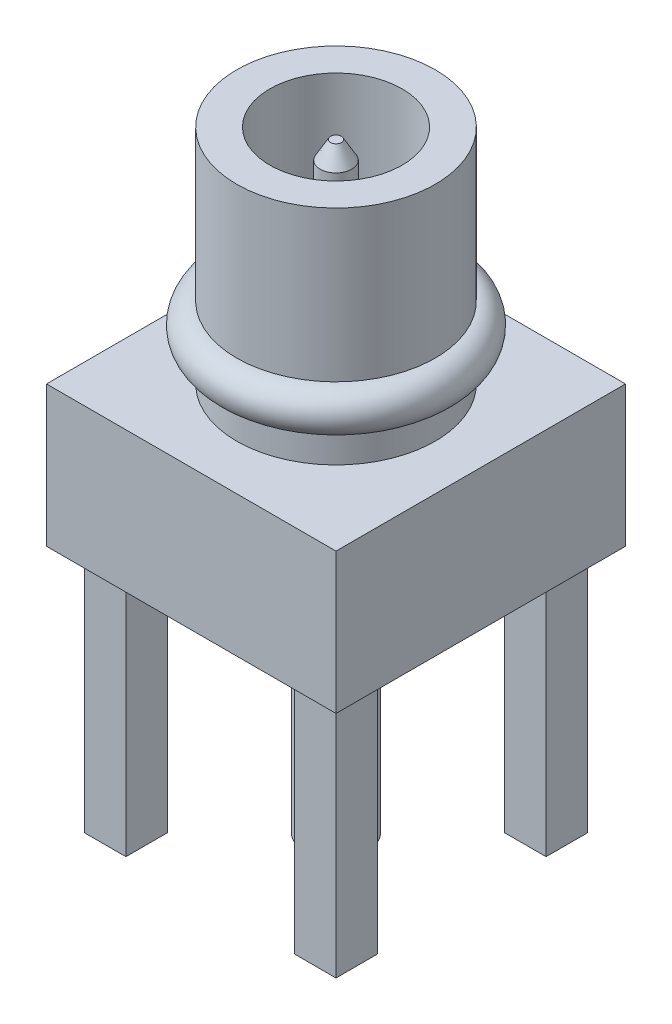
ISO-10303-21;
HEADER;
FILE_DESCRIPTION(('STEP AP214'),'2;1');
FILE_NAME('part.step','',(''),(''),'','','');
FILE_SCHEMA(('AUTOMOTIVE_DESIGN { 1 0 10303 214 1 1 1 1 }'));
ENDSEC;
DATA;
#1=APPLICATION_CONTEXT('core data for automotive mechanical design processes');
#2=APPLICATION_PROTOCOL_DEFINITION('international standard','automotive_design',2000,#1);
#3=PRODUCT_CONTEXT('',#1,'mechanical');
#4=PRODUCT('Part','Part','',(#3));
#5=PRODUCT_RELATED_PRODUCT_CATEGORY('part','',(#4));
#6=PRODUCT_DEFINITION_FORMATION('','',#4);
#7=PRODUCT_DEFINITION_CONTEXT('part definition',#1,'design');
#8=PRODUCT_DEFINITION('design','',#6,#7);
#9=PRODUCT_DEFINITION_SHAPE('','',#8);
#10=(LENGTH_UNIT() NAMED_UNIT(*) SI_UNIT(.MILLI.,.METRE.));
#11=(NAMED_UNIT(*) PLANE_ANGLE_UNIT() SI_UNIT($,.RADIAN.));
#12=(NAMED_UNIT(*) SI_UNIT($,.STERADIAN.) SOLID_ANGLE_UNIT());
#13=UNCERTAINTY_MEASURE_WITH_UNIT(LENGTH_MEASURE(1.E-05),#10,'distance_accuracy_value','');
#14=(GEOMETRIC_REPRESENTATION_CONTEXT(3) GLOBAL_UNCERTAINTY_ASSIGNED_CONTEXT((#13)) GLOBAL_UNIT_ASSIGNED_CONTEXT((#10,
#11,#12)) REPRESENTATION_CONTEXT('',''));
#15=CARTESIAN_POINT('',(0.,0.,0.));
#16=DIRECTION('',(0.,0.,1.));
#17=DIRECTION('',(1.,0.,0.));
#18=AXIS2_PLACEMENT_3D('',#15,#16,#17);
#19=CARTESIAN_POINT('',(0.,0.,0.));
#20=DIRECTION('',(0.,-1.,0.));
#21=DIRECTION('',(0.,0.,-1.));
#22=AXIS2_PLACEMENT_3D('',#19,#20,#21);
#23=PLANE('',#22);
#24=CARTESIAN_POINT('',(0.,0.,0.));
#25=DIRECTION('',(0.,-1.,0.));
#26=DIRECTION('',(0.,0.,-1.));
#27=AXIS2_PLACEMENT_3D('',#24,#25,#26);
#28=CIRCLE('',#27,1.);
#29=CARTESIAN_POINT('',(0.,0.,-1.));
#30=VERTEX_POINT('',#29);
#31=EDGE_CURVE('E694',#30,#30,#28,.T.);
#32=ORIENTED_EDGE('',*,*,#31,.F.);
#33=EDGE_LOOP('',(#32));
#34=FACE_BOUND('',#33,.T.);
#35=DIRECTION('',(0.,0.,-1.));
#36=VECTOR('',#35,1.);
#37=CARTESIAN_POINT('',(1.75,0.,1.75));
#38=LINE('',#37,#36);
#39=CARTESIAN_POINT('',(1.75,0.,1.75));
#40=VERTEX_POINT('',#39);
#41=CARTESIAN_POINT('',(1.75,0.,-1.75));
#42=VERTEX_POINT('',#41);
#43=EDGE_CURVE('E308',#40,#42,#38,.T.);
#44=ORIENTED_EDGE('',*,*,#43,.F.);
#45=DIRECTION('',(1.,0.,0.));
#46=VECTOR('',#45,1.);
#47=CARTESIAN_POINT('',(-1.75,0.,1.75));
#48=LINE('',#47,#46);
#49=CARTESIAN_POINT('',(-1.75,0.,1.75));
#50=VERTEX_POINT('',#49);
#51=EDGE_CURVE('E313',#50,#40,#48,.T.);
#52=ORIENTED_EDGE('',*,*,#51,.F.);
#53=DIRECTION('',(0.,0.,1.));
#54=VECTOR('',#53,1.);
#55=CARTESIAN_POINT('',(-1.75,0.,1.75));
#56=LINE('',#55,#54);
#57=CARTESIAN_POINT('',(-1.75,0.,-1.75));
#58=VERTEX_POINT('',#57);
#59=EDGE_CURVE('E324',#58,#50,#56,.T.);
#60=ORIENTED_EDGE('',*,*,#59,.F.);
#61=DIRECTION('',(-1.,0.,0.));
#62=VECTOR('',#61,1.);
#63=CARTESIAN_POINT('',(-1.75,0.,-1.75));
#64=LINE('',#63,#62);
#65=EDGE_CURVE('E322',#42,#58,#64,.T.);
#66=ORIENTED_EDGE('',*,*,#65,.F.);
#67=EDGE_LOOP('',(#44,#52,#60,#66));
#68=FACE_BOUND('',#67,.T.);
#69=DIRECTION('',(1.,0.,0.));
#70=VECTOR('',#69,1.);
#71=CARTESIAN_POINT('',(1.52,0.,-1.52));
#72=LINE('',#71,#70);
#73=CARTESIAN_POINT('',(1.02,0.,-1.52));
#74=VERTEX_POINT('',#73);
#75=CARTESIAN_POINT('',(1.52,0.,-1.52));
#76=VERTEX_POINT('',#75);
#77=EDGE_CURVE('E275',#74,#76,#72,.T.);
#78=ORIENTED_EDGE('',*,*,#77,.F.);
#79=DIRECTION('',(0.,0.,-1.));
#80=VECTOR('',#79,1.);
#81=CARTESIAN_POINT('',(1.02,0.,-1.52));
#82=LINE('',#81,#80);
#83=CARTESIAN_POINT('',(1.02,0.,-1.02));
#84=VERTEX_POINT('',#83);
#85=EDGE_CURVE('E261',#84,#74,#82,.T.);
#86=ORIENTED_EDGE('',*,*,#85,.F.);
#87=DIRECTION('',(-1.,0.,0.));
#88=VECTOR('',#87,1.);
#89=CARTESIAN_POINT('',(1.52,0.,-1.02));
#90=LINE('',#89,#88);
#91=CARTESIAN_POINT('',(1.52,0.,-1.02));
#92=VERTEX_POINT('',#91);
#93=EDGE_CURVE('E266',#92,#84,#90,.T.);
#94=ORIENTED_EDGE('',*,*,#93,.F.);
#95=DIRECTION('',(0.,0.,1.));
#96=VECTOR('',#95,1.);
#97=CARTESIAN_POINT('',(1.52,0.,-1.52));
#98=LINE('',#97,#96);
#99=EDGE_CURVE('E277',#76,#92,#98,.T.);
#100=ORIENTED_EDGE('',*,*,#99,.F.);
#101=EDGE_LOOP('',(#78,#86,#94,#100));
#102=FACE_BOUND('',#101,.T.);
#103=DIRECTION('',(1.,0.,0.));
#104=VECTOR('',#103,1.);
#105=CARTESIAN_POINT('',(-1.02,0.,-1.52000000000002));
#106=LINE('',#105,#104);
#107=CARTESIAN_POINT('',(-1.52,0.,-1.52000000000002));
#108=VERTEX_POINT('',#107);
#109=CARTESIAN_POINT('',(-1.02,0.,-1.52000000000002));
#110=VERTEX_POINT('',#109);
#111=EDGE_CURVE('E243',#108,#110,#106,.T.);
#112=ORIENTED_EDGE('',*,*,#111,.F.);
#113=DIRECTION('',(0.,0.,-1.));
#114=VECTOR('',#113,1.);
#115=CARTESIAN_POINT('',(-1.52,0.,-1.52000000000002));
#116=LINE('',#115,#114);
#117=CARTESIAN_POINT('',(-1.52,0.,-1.02000000000002));
#118=VERTEX_POINT('',#117);
#119=EDGE_CURVE('E229',#118,#108,#116,.T.);
#120=ORIENTED_EDGE('',*,*,#119,.F.);
#121=DIRECTION('',(-1.,0.,0.));
#122=VECTOR('',#121,1.);
#123=CARTESIAN_POINT('',(-1.02,0.,-1.02000000000002));
#124=LINE('',#123,#122);
#125=CARTESIAN_POINT('',(-1.02,0.,-1.02000000000002));
#126=VERTEX_POINT('',#125);
#127=EDGE_CURVE('E234',#126,#118,#124,.T.);
#128=ORIENTED_EDGE('',*,*,#127,.F.);
#129=DIRECTION('',(0.,0.,1.));
#130=VECTOR('',#129,1.);
#131=CARTESIAN_POINT('',(-1.02,0.,-1.52000000000002));
#132=LINE('',#131,#130);
#133=EDGE_CURVE('E245',#110,#126,#132,.T.);
#134=ORIENTED_EDGE('',*,*,#133,.F.);
#135=EDGE_LOOP('',(#112,#120,#128,#134));
#136=FACE_BOUND('',#135,.T.);
#137=DIRECTION('',(1.,0.,0.));
#138=VECTOR('',#137,1.);
#139=CARTESIAN_POINT('',(-1.02000000000001,0.,1.01999999999998));
#140=LINE('',#139,#138);
#141=CARTESIAN_POINT('',(-1.52000000000001,0.,1.01999999999998));
#142=VERTEX_POINT('',#141);
#143=CARTESIAN_POINT('',(-1.02000000000001,0.,1.01999999999998));
#144=VERTEX_POINT('',#143);
#145=EDGE_CURVE('E201',#142,#144,#140,.T.);
#146=ORIENTED_EDGE('',*,*,#145,.F.);
#147=DIRECTION('',(0.,0.,-1.));
#148=VECTOR('',#147,1.);
#149=CARTESIAN_POINT('',(-1.52000000000001,0.,1.01999999999998));
#150=LINE('',#149,#148);
#151=CARTESIAN_POINT('',(-1.52000000000001,0.,1.51999999999998));
#152=VERTEX_POINT('',#151);
#153=EDGE_CURVE('E198',#152,#142,#150,.T.);
#154=ORIENTED_EDGE('',*,*,#153,.F.);
#155=DIRECTION('',(-1.,0.,0.));
#156=VECTOR('',#155,1.);
#157=CARTESIAN_POINT('',(-1.02000000000001,0.,1.51999999999998));
#158=LINE('',#157,#156);
#159=CARTESIAN_POINT('',(-1.02000000000001,0.,1.51999999999998));
#160=VERTEX_POINT('',#159);
#161=EDGE_CURVE('E210',#160,#152,#158,.T.);
#162=ORIENTED_EDGE('',*,*,#161,.F.);
#163=DIRECTION('',(0.,0.,1.));
#164=VECTOR('',#163,1.);
#165=CARTESIAN_POINT('',(-1.02000000000001,0.,1.01999999999998));
#166=LINE('',#165,#164);
#167=EDGE_CURVE('E218',#144,#160,#166,.T.);
#168=ORIENTED_EDGE('',*,*,#167,.F.);
#169=EDGE_LOOP('',(#146,#154,#162,#168));
#170=FACE_BOUND('',#169,.T.);
#171=DIRECTION('',(1.,0.,0.));
#172=VECTOR('',#171,1.);
#173=CARTESIAN_POINT('',(1.51999999999999,0.,1.02));
#174=LINE('',#173,#172);
#175=CARTESIAN_POINT('',(1.01999999999999,0.,1.02));
#176=VERTEX_POINT('',#175);
#177=CARTESIAN_POINT('',(1.51999999999999,0.,1.02));
#178=VERTEX_POINT('',#177);
#179=EDGE_CURVE('E706',#176,#178,#174,.T.);
#180=ORIENTED_EDGE('',*,*,#179,.F.);
#181=DIRECTION('',(0.,0.,-1.));
#182=VECTOR('',#181,1.);
#183=CARTESIAN_POINT('',(1.01999999999999,0.,1.02));
#184=LINE('',#183,#182);
#185=CARTESIAN_POINT('',(1.01999999999999,0.,1.52));
#186=VERTEX_POINT('',#185);
#187=EDGE_CURVE('E196',#186,#176,#184,.T.);
#188=ORIENTED_EDGE('',*,*,#187,.F.);
#189=DIRECTION('',(-1.,0.,0.));
#190=VECTOR('',#189,1.);
#191=CARTESIAN_POINT('',(1.51999999999999,0.,1.52));
#192=LINE('',#191,#190);
#193=CARTESIAN_POINT('',(1.51999999999999,0.,1.52));
#194=VERTEX_POINT('',#193);
#195=EDGE_CURVE('E192',#194,#186,#192,.T.);
#196=ORIENTED_EDGE('',*,*,#195,.F.);
#197=DIRECTION('',(0.,0.,1.));
#198=VECTOR('',#197,1.);
#199=CARTESIAN_POINT('',(1.51999999999999,0.,1.02));
#200=LINE('',#199,#198);
#201=EDGE_CURVE('E708',#178,#194,#200,.T.);
#202=ORIENTED_EDGE('',*,*,#201,.F.);
#203=EDGE_LOOP('',(#180,#188,#196,#202));
#204=FACE_BOUND('',#203,.T.);
#205=ADVANCED_FACE('F35',(#34,#68,#102,#136,#170,#204),#23,.T.);
#206=CARTESIAN_POINT('',(0.,4.39,0.));
#207=DIRECTION('',(0.,-1.,0.));
#208=DIRECTION('',(0.,0.,-1.));
#209=AXIS2_PLACEMENT_3D('',#206,#207,#208);
#210=CYLINDRICAL_SURFACE('',#209,1.2);
#211=CARTESIAN_POINT('',(0.,4.39,0.));
#212=DIRECTION('',(0.,1.,0.));
#213=DIRECTION('',(0.,0.,1.));
#214=AXIS2_PLACEMENT_3D('',#211,#212,#213);
#215=CIRCLE('',#214,1.2);
#216=CARTESIAN_POINT('',(0.,4.39,1.2));
#217=VERTEX_POINT('',#216);
#218=EDGE_CURVE('E305',#217,#217,#215,.T.);
#219=ORIENTED_EDGE('',*,*,#218,.F.);
#220=EDGE_LOOP('',(#219));
#221=FACE_BOUND('',#220,.T.);
#222=CARTESIAN_POINT('',(0.,2.57,0.));
#223=DIRECTION('',(0.,-1.,0.));
#224=DIRECTION('',(0.,0.,-1.));
#225=AXIS2_PLACEMENT_3D('',#222,#223,#224);
#226=CIRCLE('',#225,1.2);
#227=CARTESIAN_POINT('',(0.,2.57,-1.2));
#228=VERTEX_POINT('',#227);
#229=EDGE_CURVE('E43',#228,#228,#226,.T.);
#230=ORIENTED_EDGE('',*,*,#229,.F.);
#231=EDGE_LOOP('',(#230));
#232=FACE_BOUND('',#231,.T.);
#233=ADVANCED_FACE('F345',(#221,#232),#210,.T.);
#234=CARTESIAN_POINT('',(0.,4.39,0.));
#235=DIRECTION('',(0.,1.,0.));
#236=DIRECTION('',(0.,0.,1.));
#237=AXIS2_PLACEMENT_3D('',#234,#235,#236);
#238=PLANE('',#237);
#239=CARTESIAN_POINT('',(0.,4.39,0.));
#240=DIRECTION('',(0.,-1.,0.));
#241=DIRECTION('',(0.,0.,-1.));
#242=AXIS2_PLACEMENT_3D('',#239,#240,#241);
#243=CIRCLE('',#242,0.8);
#244=CARTESIAN_POINT('',(0.,4.39,-0.8));
#245=VERTEX_POINT('',#244);
#246=EDGE_CURVE('E302',#245,#245,#243,.T.);
#247=ORIENTED_EDGE('',*,*,#246,.T.);
#248=EDGE_LOOP('',(#247));
#249=FACE_BOUND('',#248,.T.);
#250=ORIENTED_EDGE('',*,*,#218,.T.);
#251=EDGE_LOOP('',(#250));
#252=FACE_BOUND('',#251,.T.);
#253=ADVANCED_FACE('F347',(#249,#252),#238,.T.);
#254=CARTESIAN_POINT('',(0.,0.,0.));
#255=DIRECTION('',(0.,-1.,0.));
#256=DIRECTION('',(0.,0.,-1.));
#257=AXIS2_PLACEMENT_3D('',#254,#255,#256);
#258=CYLINDRICAL_SURFACE('',#257,0.8);
#259=ORIENTED_EDGE('',*,*,#246,.F.);
#260=EDGE_LOOP('',(#259));
#261=FACE_BOUND('',#260,.T.);
#262=CARTESIAN_POINT('',(0.,2.94,0.));
#263=DIRECTION('',(0.,-1.,0.));
#264=DIRECTION('',(0.,0.,-1.));
#265=AXIS2_PLACEMENT_3D('',#262,#263,#264);
#266=CIRCLE('',#265,0.8);
#267=CARTESIAN_POINT('',(0.,2.94,-0.8));
#268=VERTEX_POINT('',#267);
#269=EDGE_CURVE('E299',#268,#268,#266,.T.);
#270=ORIENTED_EDGE('',*,*,#269,.T.);
#271=EDGE_LOOP('',(#270));
#272=FACE_BOUND('',#271,.T.);
#273=ADVANCED_FACE('F355',(#261,#272),#258,.F.);
#274=CARTESIAN_POINT('',(0.,2.94,-0.8));
#275=DIRECTION('',(0.,-1.,0.));
#276=DIRECTION('',(0.,0.,-1.));
#277=AXIS2_PLACEMENT_3D('',#274,#275,#276);
#278=PLANE('',#277);
#279=ORIENTED_EDGE('',*,*,#269,.F.);
#280=EDGE_LOOP('',(#279));
#281=FACE_BOUND('',#280,.T.);
#282=CARTESIAN_POINT('',(0.,2.94,0.));
#283=DIRECTION('',(0.,-1.,0.));
#284=DIRECTION('',(0.,0.,-1.));
#285=AXIS2_PLACEMENT_3D('',#282,#283,#284);
#286=CIRCLE('',#285,0.1905);
#287=CARTESIAN_POINT('',(0.,2.94,-0.1905));
#288=VERTEX_POINT('',#287);
#289=EDGE_CURVE('E296',#288,#288,#286,.T.);
#290=ORIENTED_EDGE('',*,*,#289,.T.);
#291=EDGE_LOOP('',(#290));
#292=FACE_BOUND('',#291,.T.);
#293=ADVANCED_FACE('F400',(#281,#292),#278,.F.);
#294=CARTESIAN_POINT('',(0.,0.,0.));
#295=DIRECTION('',(0.,-1.,0.));
#296=DIRECTION('',(0.,0.,-1.));
#297=AXIS2_PLACEMENT_3D('',#294,#295,#296);
#298=CYLINDRICAL_SURFACE('',#297,0.1905);
#299=ORIENTED_EDGE('',*,*,#289,.F.);
#300=EDGE_LOOP('',(#299));
#301=FACE_BOUND('',#300,.T.);
#302=CARTESIAN_POINT('',(0.,4.04349364905389,0.));
#303=DIRECTION('',(0.,-1.,0.));
#304=DIRECTION('',(0.,0.,-1.));
#305=AXIS2_PLACEMENT_3D('',#302,#303,#304);
#306=CIRCLE('',#305,0.1905);
#307=CARTESIAN_POINT('',(0.,4.04349364905389,-0.1905));
#308=VERTEX_POINT('',#307);
#309=EDGE_CURVE('E293',#308,#308,#306,.T.);
#310=ORIENTED_EDGE('',*,*,#309,.T.);
#311=EDGE_LOOP('',(#310));
#312=FACE_BOUND('',#311,.T.);
#313=ADVANCED_FACE('F396',(#301,#312),#298,.T.);
#314=CARTESIAN_POINT('',(0.,4.26,0.));
#315=DIRECTION('',(0.,-1.,0.));
#316=DIRECTION('',(0.,0.,-1.));
#317=AXIS2_PLACEMENT_3D('',#314,#315,#316);
#318=CONICAL_SURFACE('',#317,0.0655000000000007,0.5235987755983);
#319=ORIENTED_EDGE('',*,*,#309,.F.);
#320=EDGE_LOOP('',(#319));
#321=FACE_BOUND('',#320,.T.);
#322=CARTESIAN_POINT('',(0.,4.26,0.));
#323=DIRECTION('',(0.,-1.,0.));
#324=DIRECTION('',(0.,0.,-1.));
#325=AXIS2_PLACEMENT_3D('',#322,#323,#324);
#326=CIRCLE('',#325,0.0655000000000007);
#327=CARTESIAN_POINT('',(0.,4.26,-0.0655000000000007));
#328=VERTEX_POINT('',#327);
#329=EDGE_CURVE('E290',#328,#328,#326,.T.);
#330=ORIENTED_EDGE('',*,*,#329,.T.);
#331=EDGE_LOOP('',(#330));
#332=FACE_BOUND('',#331,.T.);
#333=ADVANCED_FACE('F389',(#321,#332),#318,.T.);
#334=CARTESIAN_POINT('',(0.,4.26,-0.0655000000000007));
#335=DIRECTION('',(0.,-1.,0.));
#336=DIRECTION('',(0.,0.,-1.));
#337=AXIS2_PLACEMENT_3D('',#334,#335,#336);
#338=PLANE('',#337);
#339=ORIENTED_EDGE('',*,*,#329,.F.);
#340=EDGE_LOOP('',(#339));
#341=FACE_BOUND('',#340,.T.);
#342=ADVANCED_FACE('F380',(#341),#338,.F.);
#343=CARTESIAN_POINT('',(0.,2.32,0.));
#344=DIRECTION('',(0.,-1.,0.));
#345=DIRECTION('',(0.,0.,-1.));
#346=AXIS2_PLACEMENT_3D('',#343,#344,#345);
#347=TOROIDAL_SURFACE('',#346,1.2,0.25);
#348=CARTESIAN_POINT('',(0.,2.07,0.));
#349=DIRECTION('',(0.,1.,0.));
#350=DIRECTION('',(0.,0.,1.));
#351=AXIS2_PLACEMENT_3D('',#348,#349,#350);
#352=CIRCLE('',#351,1.2);
#353=CARTESIAN_POINT('',(0.,2.07,1.2));
#354=VERTEX_POINT('',#353);
#355=EDGE_CURVE('E11',#354,#354,#352,.T.);
#356=ORIENTED_EDGE('',*,*,#355,.T.);
#357=EDGE_LOOP('',(#356));
#358=FACE_BOUND('',#357,.T.);
#359=ORIENTED_EDGE('',*,*,#229,.T.);
#360=EDGE_LOOP('',(#359));
#361=FACE_BOUND('',#360,.T.);
#362=ADVANCED_FACE('F343',(#358,#361),#347,.T.);
#363=CARTESIAN_POINT('',(-1.75,1.7,1.75));
#364=DIRECTION('',(0.,0.,-1.));
#365=DIRECTION('',(-1.,0.,0.));
#366=AXIS2_PLACEMENT_3D('',#363,#364,#365);
#367=PLANE('',#366);
#368=ORIENTED_EDGE('',*,*,#51,.T.);
#369=DIRECTION('',(0.,-1.,0.));
#370=VECTOR('',#369,1.);
#371=CARTESIAN_POINT('',(1.75,1.7,1.75));
#372=LINE('',#371,#370);
#373=CARTESIAN_POINT('',(1.75,1.7,1.75));
#374=VERTEX_POINT('',#373);
#375=EDGE_CURVE('E319',#374,#40,#372,.T.);
#376=ORIENTED_EDGE('',*,*,#375,.F.);
#377=DIRECTION('',(1.,0.,0.));
#378=VECTOR('',#377,1.);
#379=CARTESIAN_POINT('',(-1.75,1.7,1.75));
#380=LINE('',#379,#378);
#381=CARTESIAN_POINT('',(-1.75,1.7,1.75));
#382=VERTEX_POINT('',#381);
#383=EDGE_CURVE('E317',#382,#374,#380,.T.);
#384=ORIENTED_EDGE('',*,*,#383,.F.);
#385=DIRECTION('',(0.,-1.,0.));
#386=VECTOR('',#385,1.);
#387=CARTESIAN_POINT('',(-1.75,1.7,1.75));
#388=LINE('',#387,#386);
#389=EDGE_CURVE('E329',#382,#50,#388,.T.);
#390=ORIENTED_EDGE('',*,*,#389,.T.);
#391=EDGE_LOOP('',(#368,#376,#384,#390));
#392=FACE_BOUND('',#391,.T.);
#393=ADVANCED_FACE('F379',(#392),#367,.F.);
#394=CARTESIAN_POINT('',(-1.75,1.7,1.75));
#395=DIRECTION('',(1.,0.,0.));
#396=DIRECTION('',(0.,0.,-1.));
#397=AXIS2_PLACEMENT_3D('',#394,#395,#396);
#398=PLANE('',#397);
#399=ORIENTED_EDGE('',*,*,#59,.T.);
#400=ORIENTED_EDGE('',*,*,#389,.F.);
#401=DIRECTION('',(0.,0.,1.));
#402=VECTOR('',#401,1.);
#403=CARTESIAN_POINT('',(-1.75,1.7,1.75));
#404=LINE('',#403,#402);
#405=CARTESIAN_POINT('',(-1.75,1.7,-1.75));
#406=VERTEX_POINT('',#405);
#407=EDGE_CURVE('E315',#406,#382,#404,.T.);
#408=ORIENTED_EDGE('',*,*,#407,.F.);
#409=DIRECTION('',(0.,-1.,0.));
#410=VECTOR('',#409,1.);
#411=CARTESIAN_POINT('',(-1.75,1.7,-1.75));
#412=LINE('',#411,#410);
#413=EDGE_CURVE('E332',#406,#58,#412,.T.);
#414=ORIENTED_EDGE('',*,*,#413,.T.);
#415=EDGE_LOOP('',(#399,#400,#408,#414));
#416=FACE_BOUND('',#415,.T.);
#417=ADVANCED_FACE('F386',(#416),#398,.F.);
#418=CARTESIAN_POINT('',(-1.75,1.7,-1.75));
#419=DIRECTION('',(0.,0.,1.));
#420=DIRECTION('',(1.,0.,0.));
#421=AXIS2_PLACEMENT_3D('',#418,#419,#420);
#422=PLANE('',#421);
#423=ORIENTED_EDGE('',*,*,#65,.T.);
#424=ORIENTED_EDGE('',*,*,#413,.F.);
#425=DIRECTION('',(-1.,0.,0.));
#426=VECTOR('',#425,1.);
#427=CARTESIAN_POINT('',(-1.75,1.7,-1.75));
#428=LINE('',#427,#426);
#429=CARTESIAN_POINT('',(1.75,1.7,-1.75));
#430=VERTEX_POINT('',#429);
#431=EDGE_CURVE('E312',#430,#406,#428,.T.);
#432=ORIENTED_EDGE('',*,*,#431,.F.);
#433=DIRECTION('',(0.,-1.,0.));
#434=VECTOR('',#433,1.);
#435=CARTESIAN_POINT('',(1.75,1.7,-1.75));
#436=LINE('',#435,#434);
#437=EDGE_CURVE('E335',#430,#42,#436,.T.);
#438=ORIENTED_EDGE('',*,*,#437,.T.);
#439=EDGE_LOOP('',(#423,#424,#432,#438));
#440=FACE_BOUND('',#439,.T.);
#441=ADVANCED_FACE('F766',(#440),#422,.F.);
#442=CARTESIAN_POINT('',(1.75,1.7,1.75));
#443=DIRECTION('',(-1.,0.,0.));
#444=DIRECTION('',(0.,0.,1.));
#445=AXIS2_PLACEMENT_3D('',#442,#443,#444);
#446=PLANE('',#445);
#447=ORIENTED_EDGE('',*,*,#43,.T.);
#448=ORIENTED_EDGE('',*,*,#437,.F.);
#449=DIRECTION('',(0.,0.,-1.));
#450=VECTOR('',#449,1.);
#451=CARTESIAN_POINT('',(1.75,1.7,1.75));
#452=LINE('',#451,#450);
#453=EDGE_CURVE('E309',#374,#430,#452,.T.);
#454=ORIENTED_EDGE('',*,*,#453,.F.);
#455=ORIENTED_EDGE('',*,*,#375,.T.);
#456=EDGE_LOOP('',(#447,#448,#454,#455));
#457=FACE_BOUND('',#456,.T.);
#458=ADVANCED_FACE('F37',(#457),#446,.F.);
#459=CARTESIAN_POINT('',(0.,1.7,0.));
#460=DIRECTION('',(0.,-1.,0.));
#461=DIRECTION('',(0.,0.,-1.));
#462=AXIS2_PLACEMENT_3D('',#459,#460,#461);
#463=PLANE('',#462);
#464=CARTESIAN_POINT('',(0.,1.7,0.));
#465=DIRECTION('',(0.,-1.,0.));
#466=DIRECTION('',(0.,0.,-1.));
#467=AXIS2_PLACEMENT_3D('',#464,#465,#466);
#468=CIRCLE('',#467,1.2);
#469=CARTESIAN_POINT('',(0.,1.7,-1.2));
#470=VERTEX_POINT('',#469);
#471=EDGE_CURVE('E338',#470,#470,#468,.F.);
#472=ORIENTED_EDGE('',*,*,#471,.F.);
#473=EDGE_LOOP('',(#472));
#474=FACE_BOUND('',#473,.T.);
#475=ORIENTED_EDGE('',*,*,#453,.T.);
#476=ORIENTED_EDGE('',*,*,#431,.T.);
#477=ORIENTED_EDGE('',*,*,#407,.T.);
#478=ORIENTED_EDGE('',*,*,#383,.T.);
#479=EDGE_LOOP('',(#475,#476,#477,#478));
#480=FACE_BOUND('',#479,.T.);
#481=ADVANCED_FACE('F364',(#474,#480),#463,.F.);
#482=ORIENTED_EDGE('',*,*,#471,.T.);
#483=EDGE_LOOP('',(#482));
#484=FACE_BOUND('',#483,.T.);
#485=ORIENTED_EDGE('',*,*,#355,.F.);
#486=EDGE_LOOP('',(#485));
#487=FACE_BOUND('',#486,.T.);
#488=ADVANCED_FACE('F350',(#484,#487),#210,.T.);
#489=CARTESIAN_POINT('',(1.02,-3.,-1.52));
#490=DIRECTION('',(1.,0.,0.));
#491=DIRECTION('',(0.,0.,-1.));
#492=AXIS2_PLACEMENT_3D('',#489,#490,#491);
#493=PLANE('',#492);
#494=ORIENTED_EDGE('',*,*,#85,.T.);
#495=DIRECTION('',(0.,1.,0.));
#496=VECTOR('',#495,1.);
#497=CARTESIAN_POINT('',(1.02,-3.,-1.52));
#498=LINE('',#497,#496);
#499=CARTESIAN_POINT('',(1.02,-3.,-1.52));
#500=VERTEX_POINT('',#499);
#501=EDGE_CURVE('E288',#500,#74,#498,.T.);
#502=ORIENTED_EDGE('',*,*,#501,.F.);
#503=DIRECTION('',(0.,0.,-1.));
#504=VECTOR('',#503,1.);
#505=CARTESIAN_POINT('',(1.02,-3.,-1.52));
#506=LINE('',#505,#504);
#507=CARTESIAN_POINT('',(1.02,-3.,-1.02));
#508=VERTEX_POINT('',#507);
#509=EDGE_CURVE('E262',#508,#500,#506,.T.);
#510=ORIENTED_EDGE('',*,*,#509,.F.);
#511=DIRECTION('',(0.,1.,0.));
#512=VECTOR('',#511,1.);
#513=CARTESIAN_POINT('',(1.02,-3.,-1.02));
#514=LINE('',#513,#512);
#515=EDGE_CURVE('E272',#508,#84,#514,.T.);
#516=ORIENTED_EDGE('',*,*,#515,.T.);
#517=EDGE_LOOP('',(#494,#502,#510,#516));
#518=FACE_BOUND('',#517,.T.);
#519=ADVANCED_FACE('F363',(#518),#493,.F.);
#520=CARTESIAN_POINT('',(1.52,-3.,-1.52));
#521=DIRECTION('',(0.,0.,1.));
#522=DIRECTION('',(1.,0.,0.));
#523=AXIS2_PLACEMENT_3D('',#520,#521,#522);
#524=PLANE('',#523);
#525=ORIENTED_EDGE('',*,*,#77,.T.);
#526=DIRECTION('',(0.,1.,0.));
#527=VECTOR('',#526,1.);
#528=CARTESIAN_POINT('',(1.52,-3.,-1.52));
#529=LINE('',#528,#527);
#530=CARTESIAN_POINT('',(1.52,-3.,-1.52));
#531=VERTEX_POINT('',#530);
#532=EDGE_CURVE('E285',#531,#76,#529,.T.);
#533=ORIENTED_EDGE('',*,*,#532,.F.);
#534=DIRECTION('',(1.,0.,0.));
#535=VECTOR('',#534,1.);
#536=CARTESIAN_POINT('',(1.52,-3.,-1.52));
#537=LINE('',#536,#535);
#538=EDGE_CURVE('E265',#500,#531,#537,.T.);
#539=ORIENTED_EDGE('',*,*,#538,.F.);
#540=ORIENTED_EDGE('',*,*,#501,.T.);
#541=EDGE_LOOP('',(#525,#533,#539,#540));
#542=FACE_BOUND('',#541,.T.);
#543=ADVANCED_FACE('F370',(#542),#524,.F.);
#544=CARTESIAN_POINT('',(1.52,-3.,-1.52));
#545=DIRECTION('',(-1.,0.,0.));
#546=DIRECTION('',(0.,0.,1.));
#547=AXIS2_PLACEMENT_3D('',#544,#545,#546);
#548=PLANE('',#547);
#549=ORIENTED_EDGE('',*,*,#99,.T.);
#550=DIRECTION('',(0.,1.,0.));
#551=VECTOR('',#550,1.);
#552=CARTESIAN_POINT('',(1.52,-3.,-1.02));
#553=LINE('',#552,#551);
#554=CARTESIAN_POINT('',(1.52,-3.,-1.02));
#555=VERTEX_POINT('',#554);
#556=EDGE_CURVE('E283',#555,#92,#553,.T.);
#557=ORIENTED_EDGE('',*,*,#556,.F.);
#558=DIRECTION('',(0.,0.,1.));
#559=VECTOR('',#558,1.);
#560=CARTESIAN_POINT('',(1.52,-3.,-1.52));
#561=LINE('',#560,#559);
#562=EDGE_CURVE('E268',#531,#555,#561,.T.);
#563=ORIENTED_EDGE('',*,*,#562,.F.);
#564=ORIENTED_EDGE('',*,*,#532,.T.);
#565=EDGE_LOOP('',(#549,#557,#563,#564));
#566=FACE_BOUND('',#565,.T.);
#567=ADVANCED_FACE('F466',(#566),#548,.F.);
#568=CARTESIAN_POINT('',(1.52,-3.,-1.02));
#569=DIRECTION('',(0.,0.,-1.));
#570=DIRECTION('',(-1.,0.,0.));
#571=AXIS2_PLACEMENT_3D('',#568,#569,#570);
#572=PLANE('',#571);
#573=ORIENTED_EDGE('',*,*,#93,.T.);
#574=ORIENTED_EDGE('',*,*,#515,.F.);
#575=DIRECTION('',(-1.,0.,0.));
#576=VECTOR('',#575,1.);
#577=CARTESIAN_POINT('',(1.52,-3.,-1.02));
#578=LINE('',#577,#576);
#579=EDGE_CURVE('E270',#555,#508,#578,.T.);
#580=ORIENTED_EDGE('',*,*,#579,.F.);
#581=ORIENTED_EDGE('',*,*,#556,.T.);
#582=EDGE_LOOP('',(#573,#574,#580,#581));
#583=FACE_BOUND('',#582,.T.);
#584=ADVANCED_FACE('F475',(#583),#572,.F.);
#585=CARTESIAN_POINT('',(0.,-3.,0.));
#586=DIRECTION('',(0.,-1.,0.));
#587=DIRECTION('',(0.,0.,-1.));
#588=AXIS2_PLACEMENT_3D('',#585,#586,#587);
#589=PLANE('',#588);
#590=ORIENTED_EDGE('',*,*,#509,.T.);
#591=ORIENTED_EDGE('',*,*,#538,.T.);
#592=ORIENTED_EDGE('',*,*,#562,.T.);
#593=ORIENTED_EDGE('',*,*,#579,.T.);
#594=EDGE_LOOP('',(#590,#591,#592,#593));
#595=FACE_BOUND('',#594,.T.);
#596=ADVANCED_FACE('F485',(#595),#589,.T.);
#597=CARTESIAN_POINT('',(-1.52,-3.,-1.52000000000002));
#598=DIRECTION('',(1.,0.,0.));
#599=DIRECTION('',(0.,0.,-1.));
#600=AXIS2_PLACEMENT_3D('',#597,#598,#599);
#601=PLANE('',#600);
#602=ORIENTED_EDGE('',*,*,#119,.T.);
#603=DIRECTION('',(0.,1.,0.));
#604=VECTOR('',#603,1.);
#605=CARTESIAN_POINT('',(-1.52,-3.,-1.52000000000002));
#606=LINE('',#605,#604);
#607=CARTESIAN_POINT('',(-1.52,-3.,-1.52000000000002));
#608=VERTEX_POINT('',#607);
#609=EDGE_CURVE('E256',#608,#108,#606,.T.);
#610=ORIENTED_EDGE('',*,*,#609,.F.);
#611=DIRECTION('',(0.,0.,-1.));
#612=VECTOR('',#611,1.);
#613=CARTESIAN_POINT('',(-1.52,-3.,-1.52000000000002));
#614=LINE('',#613,#612);
#615=CARTESIAN_POINT('',(-1.52,-3.,-1.02000000000002));
#616=VERTEX_POINT('',#615);
#617=EDGE_CURVE('E230',#616,#608,#614,.T.);
#618=ORIENTED_EDGE('',*,*,#617,.F.);
#619=DIRECTION('',(0.,1.,0.));
#620=VECTOR('',#619,1.);
#621=CARTESIAN_POINT('',(-1.52,-3.,-1.02000000000002));
#622=LINE('',#621,#620);
#623=EDGE_CURVE('E240',#616,#118,#622,.T.);
#624=ORIENTED_EDGE('',*,*,#623,.T.);
#625=EDGE_LOOP('',(#602,#610,#618,#624));
#626=FACE_BOUND('',#625,.T.);
#627=ADVANCED_FACE('F495',(#626),#601,.F.);
#628=CARTESIAN_POINT('',(-1.02,-3.,-1.52000000000002));
#629=DIRECTION('',(0.,0.,1.));
#630=DIRECTION('',(1.,0.,0.));
#631=AXIS2_PLACEMENT_3D('',#628,#629,#630);
#632=PLANE('',#631);
#633=ORIENTED_EDGE('',*,*,#111,.T.);
#634=DIRECTION('',(0.,1.,0.));
#635=VECTOR('',#634,1.);
#636=CARTESIAN_POINT('',(-1.02,-3.,-1.52000000000002));
#637=LINE('',#636,#635);
#638=CARTESIAN_POINT('',(-1.02,-3.,-1.52000000000002));
#639=VERTEX_POINT('',#638);
#640=EDGE_CURVE('E253',#639,#110,#637,.T.);
#641=ORIENTED_EDGE('',*,*,#640,.F.);
#642=DIRECTION('',(1.,0.,0.));
#643=VECTOR('',#642,1.);
#644=CARTESIAN_POINT('',(-1.02,-3.,-1.52000000000002));
#645=LINE('',#644,#643);
#646=EDGE_CURVE('E233',#608,#639,#645,.T.);
#647=ORIENTED_EDGE('',*,*,#646,.F.);
#648=ORIENTED_EDGE('',*,*,#609,.T.);
#649=EDGE_LOOP('',(#633,#641,#647,#648));
#650=FACE_BOUND('',#649,.T.);
#651=ADVANCED_FACE('F520',(#650),#632,.F.);
#652=CARTESIAN_POINT('',(-1.02,-3.,-1.52000000000002));
#653=DIRECTION('',(-1.,0.,0.));
#654=DIRECTION('',(0.,0.,1.));
#655=AXIS2_PLACEMENT_3D('',#652,#653,#654);
#656=PLANE('',#655);
#657=ORIENTED_EDGE('',*,*,#133,.T.);
#658=DIRECTION('',(0.,1.,0.));
#659=VECTOR('',#658,1.);
#660=CARTESIAN_POINT('',(-1.02,-3.,-1.02000000000002));
#661=LINE('',#660,#659);
#662=CARTESIAN_POINT('',(-1.02,-3.,-1.02000000000002));
#663=VERTEX_POINT('',#662);
#664=EDGE_CURVE('E251',#663,#126,#661,.T.);
#665=ORIENTED_EDGE('',*,*,#664,.F.);
#666=DIRECTION('',(0.,0.,1.));
#667=VECTOR('',#666,1.);
#668=CARTESIAN_POINT('',(-1.02,-3.,-1.52000000000002));
#669=LINE('',#668,#667);
#670=EDGE_CURVE('E236',#639,#663,#669,.T.);
#671=ORIENTED_EDGE('',*,*,#670,.F.);
#672=ORIENTED_EDGE('',*,*,#640,.T.);
#673=EDGE_LOOP('',(#657,#665,#671,#672));
#674=FACE_BOUND('',#673,.T.);
#675=ADVANCED_FACE('F530',(#674),#656,.F.);
#676=CARTESIAN_POINT('',(-1.02,-3.,-1.02000000000002));
#677=DIRECTION('',(0.,0.,-1.));
#678=DIRECTION('',(-1.,0.,0.));
#679=AXIS2_PLACEMENT_3D('',#676,#677,#678);
#680=PLANE('',#679);
#681=ORIENTED_EDGE('',*,*,#127,.T.);
#682=ORIENTED_EDGE('',*,*,#623,.F.);
#683=DIRECTION('',(-1.,0.,0.));
#684=VECTOR('',#683,1.);
#685=CARTESIAN_POINT('',(-1.02,-3.,-1.02000000000002));
#686=LINE('',#685,#684);
#687=EDGE_CURVE('E238',#663,#616,#686,.T.);
#688=ORIENTED_EDGE('',*,*,#687,.F.);
#689=ORIENTED_EDGE('',*,*,#664,.T.);
#690=EDGE_LOOP('',(#681,#682,#688,#689));
#691=FACE_BOUND('',#690,.T.);
#692=ADVANCED_FACE('F540',(#691),#680,.F.);
#693=CARTESIAN_POINT('',(0.,-3.,0.));
#694=DIRECTION('',(0.,-1.,0.));
#695=DIRECTION('',(0.,0.,-1.));
#696=AXIS2_PLACEMENT_3D('',#693,#694,#695);
#697=PLANE('',#696);
#698=ORIENTED_EDGE('',*,*,#617,.T.);
#699=ORIENTED_EDGE('',*,*,#646,.T.);
#700=ORIENTED_EDGE('',*,*,#670,.T.);
#701=ORIENTED_EDGE('',*,*,#687,.T.);
#702=EDGE_LOOP('',(#698,#699,#700,#701));
#703=FACE_BOUND('',#702,.T.);
#704=ADVANCED_FACE('F550',(#703),#697,.T.);
#705=CARTESIAN_POINT('',(-1.52000000000001,-3.,1.01999999999998));
#706=DIRECTION('',(1.,0.,0.));
#707=DIRECTION('',(0.,0.,-1.));
#708=AXIS2_PLACEMENT_3D('',#705,#706,#707);
#709=PLANE('',#708);
#710=ORIENTED_EDGE('',*,*,#153,.T.);
#711=DIRECTION('',(0.,1.,0.));
#712=VECTOR('',#711,1.);
#713=CARTESIAN_POINT('',(-1.52000000000001,-3.,1.01999999999998));
#714=LINE('',#713,#712);
#715=CARTESIAN_POINT('',(-1.52000000000001,-3.,1.01999999999998));
#716=VERTEX_POINT('',#715);
#717=EDGE_CURVE('E227',#716,#142,#714,.T.);
#718=ORIENTED_EDGE('',*,*,#717,.F.);
#719=DIRECTION('',(0.,0.,-1.));
#720=VECTOR('',#719,1.);
#721=CARTESIAN_POINT('',(-1.52000000000001,-3.,1.01999999999998));
#722=LINE('',#721,#720);
#723=CARTESIAN_POINT('',(-1.52000000000001,-3.,1.51999999999998));
#724=VERTEX_POINT('',#723);
#725=EDGE_CURVE('E206',#724,#716,#722,.T.);
#726=ORIENTED_EDGE('',*,*,#725,.F.);
#727=DIRECTION('',(0.,1.,0.));
#728=VECTOR('',#727,1.);
#729=CARTESIAN_POINT('',(-1.52000000000001,-3.,1.51999999999998));
#730=LINE('',#729,#728);
#731=EDGE_CURVE('E215',#724,#152,#730,.T.);
#732=ORIENTED_EDGE('',*,*,#731,.T.);
#733=EDGE_LOOP('',(#710,#718,#726,#732));
#734=FACE_BOUND('',#733,.T.);
#735=ADVANCED_FACE('F560',(#734),#709,.F.);
#736=CARTESIAN_POINT('',(-1.02000000000001,-3.,1.01999999999998));
#737=DIRECTION('',(0.,0.,1.));
#738=DIRECTION('',(1.,0.,0.));
#739=AXIS2_PLACEMENT_3D('',#736,#737,#738);
#740=PLANE('',#739);
#741=ORIENTED_EDGE('',*,*,#145,.T.);
#742=DIRECTION('',(0.,1.,0.));
#743=VECTOR('',#742,1.);
#744=CARTESIAN_POINT('',(-1.02000000000001,-3.,1.01999999999998));
#745=LINE('',#744,#743);
#746=CARTESIAN_POINT('',(-1.02000000000001,-3.,1.01999999999998));
#747=VERTEX_POINT('',#746);
#748=EDGE_CURVE('E224',#747,#144,#745,.T.);
#749=ORIENTED_EDGE('',*,*,#748,.F.);
#750=DIRECTION('',(1.,0.,0.));
#751=VECTOR('',#750,1.);
#752=CARTESIAN_POINT('',(-1.02000000000001,-3.,1.01999999999998));
#753=LINE('',#752,#751);
#754=EDGE_CURVE('E209',#716,#747,#753,.T.);
#755=ORIENTED_EDGE('',*,*,#754,.F.);
#756=ORIENTED_EDGE('',*,*,#717,.T.);
#757=EDGE_LOOP('',(#741,#749,#755,#756));
#758=FACE_BOUND('',#757,.T.);
#759=ADVANCED_FACE('F570',(#758),#740,.F.);
#760=CARTESIAN_POINT('',(-1.02000000000001,-3.,1.01999999999998));
#761=DIRECTION('',(-1.,0.,0.));
#762=DIRECTION('',(0.,0.,1.));
#763=AXIS2_PLACEMENT_3D('',#760,#761,#762);
#764=PLANE('',#763);
#765=ORIENTED_EDGE('',*,*,#167,.T.);
#766=DIRECTION('',(0.,1.,0.));
#767=VECTOR('',#766,1.);
#768=CARTESIAN_POINT('',(-1.02000000000001,-3.,1.51999999999998));
#769=LINE('',#768,#767);
#770=CARTESIAN_POINT('',(-1.02000000000001,-3.,1.51999999999998));
#771=VERTEX_POINT('',#770);
#772=EDGE_CURVE('E58',#771,#160,#769,.T.);
#773=ORIENTED_EDGE('',*,*,#772,.F.);
#774=DIRECTION('',(0.,0.,1.));
#775=VECTOR('',#774,1.);
#776=CARTESIAN_POINT('',(-1.02000000000001,-3.,1.01999999999998));
#777=LINE('',#776,#775);
#778=EDGE_CURVE('E212',#747,#771,#777,.T.);
#779=ORIENTED_EDGE('',*,*,#778,.F.);
#780=ORIENTED_EDGE('',*,*,#748,.T.);
#781=EDGE_LOOP('',(#765,#773,#779,#780));
#782=FACE_BOUND('',#781,.T.);
#783=ADVANCED_FACE('F580',(#782),#764,.F.);
#784=CARTESIAN_POINT('',(-1.02000000000001,-3.,1.51999999999998));
#785=DIRECTION('',(0.,0.,-1.));
#786=DIRECTION('',(-1.,0.,0.));
#787=AXIS2_PLACEMENT_3D('',#784,#785,#786);
#788=PLANE('',#787);
#789=ORIENTED_EDGE('',*,*,#161,.T.);
#790=ORIENTED_EDGE('',*,*,#731,.F.);
#791=DIRECTION('',(-1.,0.,0.));
#792=VECTOR('',#791,1.);
#793=CARTESIAN_POINT('',(-1.02000000000001,-3.,1.51999999999998));
#794=LINE('',#793,#792);
#795=EDGE_CURVE('E214',#771,#724,#794,.T.);
#796=ORIENTED_EDGE('',*,*,#795,.F.);
#797=ORIENTED_EDGE('',*,*,#772,.T.);
#798=EDGE_LOOP('',(#789,#790,#796,#797));
#799=FACE_BOUND('',#798,.T.);
#800=ADVANCED_FACE('F590',(#799),#788,.F.);
#801=CARTESIAN_POINT('',(0.,-3.,0.));
#802=DIRECTION('',(0.,-1.,0.));
#803=DIRECTION('',(0.,0.,-1.));
#804=AXIS2_PLACEMENT_3D('',#801,#802,#803);
#805=PLANE('',#804);
#806=ORIENTED_EDGE('',*,*,#725,.T.);
#807=ORIENTED_EDGE('',*,*,#754,.T.);
#808=ORIENTED_EDGE('',*,*,#778,.T.);
#809=ORIENTED_EDGE('',*,*,#795,.T.);
#810=EDGE_LOOP('',(#806,#807,#808,#809));
#811=FACE_BOUND('',#810,.T.);
#812=ADVANCED_FACE('F600',(#811),#805,.T.);
#813=CARTESIAN_POINT('',(1.01999999999999,-3.,1.02));
#814=DIRECTION('',(1.,0.,0.));
#815=DIRECTION('',(0.,0.,-1.));
#816=AXIS2_PLACEMENT_3D('',#813,#814,#815);
#817=PLANE('',#816);
#818=ORIENTED_EDGE('',*,*,#187,.T.);
#819=DIRECTION('',(0.,1.,0.));
#820=VECTOR('',#819,1.);
#821=CARTESIAN_POINT('',(1.01999999999999,-3.,1.02));
#822=LINE('',#821,#820);
#823=CARTESIAN_POINT('',(1.01999999999999,-3.,1.02));
#824=VERTEX_POINT('',#823);
#825=EDGE_CURVE('E177',#824,#176,#822,.T.);
#826=ORIENTED_EDGE('',*,*,#825,.F.);
#827=DIRECTION('',(0.,0.,-1.));
#828=VECTOR('',#827,1.);
#829=CARTESIAN_POINT('',(1.01999999999999,-3.,1.02));
#830=LINE('',#829,#828);
#831=CARTESIAN_POINT('',(1.01999999999999,-3.,1.52));
#832=VERTEX_POINT('',#831);
#833=EDGE_CURVE('E184',#832,#824,#830,.T.);
#834=ORIENTED_EDGE('',*,*,#833,.F.);
#835=DIRECTION('',(0.,1.,0.));
#836=VECTOR('',#835,1.);
#837=CARTESIAN_POINT('',(1.01999999999999,-3.,1.52));
#838=LINE('',#837,#836);
#839=EDGE_CURVE('E704',#832,#186,#838,.T.);
#840=ORIENTED_EDGE('',*,*,#839,.T.);
#841=EDGE_LOOP('',(#818,#826,#834,#840));
#842=FACE_BOUND('',#841,.T.);
#843=ADVANCED_FACE('F194',(#842),#817,.F.);
#844=CARTESIAN_POINT('',(1.51999999999999,-3.,1.02));
#845=DIRECTION('',(0.,0.,1.));
#846=DIRECTION('',(1.,0.,0.));
#847=AXIS2_PLACEMENT_3D('',#844,#845,#846);
#848=PLANE('',#847);
#849=ORIENTED_EDGE('',*,*,#179,.T.);
#850=DIRECTION('',(0.,1.,0.));
#851=VECTOR('',#850,1.);
#852=CARTESIAN_POINT('',(1.51999999999999,-3.,1.02));
#853=LINE('',#852,#851);
#854=CARTESIAN_POINT('',(1.51999999999999,-3.,1.02));
#855=VERTEX_POINT('',#854);
#856=EDGE_CURVE('E180',#855,#178,#853,.T.);
#857=ORIENTED_EDGE('',*,*,#856,.F.);
#858=DIRECTION('',(1.,0.,0.));
#859=VECTOR('',#858,1.);
#860=CARTESIAN_POINT('',(1.51999999999999,-3.,1.02));
#861=LINE('',#860,#859);
#862=EDGE_CURVE('E173',#824,#855,#861,.T.);
#863=ORIENTED_EDGE('',*,*,#862,.F.);
#864=ORIENTED_EDGE('',*,*,#825,.T.);
#865=EDGE_LOOP('',(#849,#857,#863,#864));
#866=FACE_BOUND('',#865,.T.);
#867=ADVANCED_FACE('F175',(#866),#848,.F.);
#868=CARTESIAN_POINT('',(1.51999999999999,-3.,1.02));
#869=DIRECTION('',(-1.,0.,0.));
#870=DIRECTION('',(0.,0.,1.));
#871=AXIS2_PLACEMENT_3D('',#868,#869,#870);
#872=PLANE('',#871);
#873=ORIENTED_EDGE('',*,*,#201,.T.);
#874=DIRECTION('',(0.,1.,0.));
#875=VECTOR('',#874,1.);
#876=CARTESIAN_POINT('',(1.51999999999999,-3.,1.52));
#877=LINE('',#876,#875);
#878=CARTESIAN_POINT('',(1.51999999999999,-3.,1.52));
#879=VERTEX_POINT('',#878);
#880=EDGE_CURVE('E50',#879,#194,#877,.T.);
#881=ORIENTED_EDGE('',*,*,#880,.F.);
#882=DIRECTION('',(0.,0.,1.));
#883=VECTOR('',#882,1.);
#884=CARTESIAN_POINT('',(1.51999999999999,-3.,1.02));
#885=LINE('',#884,#883);
#886=EDGE_CURVE('E183',#855,#879,#885,.T.);
#887=ORIENTED_EDGE('',*,*,#886,.F.);
#888=ORIENTED_EDGE('',*,*,#856,.T.);
#889=EDGE_LOOP('',(#873,#881,#887,#888));
#890=FACE_BOUND('',#889,.T.);
#891=ADVANCED_FACE('F626',(#890),#872,.F.);
#892=CARTESIAN_POINT('',(1.51999999999999,-3.,1.52));
#893=DIRECTION('',(0.,0.,-1.));
#894=DIRECTION('',(-1.,0.,0.));
#895=AXIS2_PLACEMENT_3D('',#892,#893,#894);
#896=PLANE('',#895);
#897=ORIENTED_EDGE('',*,*,#195,.T.);
#898=ORIENTED_EDGE('',*,*,#839,.F.);
#899=DIRECTION('',(-1.,0.,0.));
#900=VECTOR('',#899,1.);
#901=CARTESIAN_POINT('',(1.51999999999999,-3.,1.52));
#902=LINE('',#901,#900);
#903=EDGE_CURVE('E188',#879,#832,#902,.T.);
#904=ORIENTED_EDGE('',*,*,#903,.F.);
#905=ORIENTED_EDGE('',*,*,#880,.T.);
#906=EDGE_LOOP('',(#897,#898,#904,#905));
#907=FACE_BOUND('',#906,.T.);
#908=ADVANCED_FACE('F635',(#907),#896,.F.);
#909=CARTESIAN_POINT('',(0.,-3.,0.));
#910=DIRECTION('',(0.,-1.,0.));
#911=DIRECTION('',(0.,0.,-1.));
#912=AXIS2_PLACEMENT_3D('',#909,#910,#911);
#913=PLANE('',#912);
#914=ORIENTED_EDGE('',*,*,#833,.T.);
#915=ORIENTED_EDGE('',*,*,#862,.T.);
#916=ORIENTED_EDGE('',*,*,#886,.T.);
#917=ORIENTED_EDGE('',*,*,#903,.T.);
#918=EDGE_LOOP('',(#914,#915,#916,#917));
#919=FACE_BOUND('',#918,.T.);
#920=ADVANCED_FACE('F187',(#919),#913,.T.);
#921=CARTESIAN_POINT('',(0.,0.001,0.));
#922=DIRECTION('',(0.,-1.,0.));
#923=DIRECTION('',(0.,0.,-1.));
#924=AXIS2_PLACEMENT_3D('',#921,#922,#923);
#925=CYLINDRICAL_SURFACE('',#924,1.);
#926=CARTESIAN_POINT('',(0.,0.001,0.));
#927=DIRECTION('',(0.,-1.,0.));
#928=DIRECTION('',(0.,0.,-1.));
#929=AXIS2_PLACEMENT_3D('',#926,#927,#928);
#930=CIRCLE('',#929,1.);
#931=CARTESIAN_POINT('',(0.,0.001,-1.));
#932=VERTEX_POINT('',#931);
#933=EDGE_CURVE('E697',#932,#932,#930,.T.);
#934=ORIENTED_EDGE('',*,*,#933,.F.);
#935=EDGE_LOOP('',(#934));
#936=FACE_BOUND('',#935,.T.);
#937=ORIENTED_EDGE('',*,*,#31,.T.);
#938=EDGE_LOOP('',(#937));
#939=FACE_BOUND('',#938,.T.);
#940=ADVANCED_FACE('F653',(#936,#939),#925,.F.);
#941=CARTESIAN_POINT('',(0.,0.001,0.));
#942=DIRECTION('',(0.,-1.,0.));
#943=DIRECTION('',(0.,0.,-1.));
#944=AXIS2_PLACEMENT_3D('',#941,#942,#943);
#945=PLANE('',#944);
#946=CARTESIAN_POINT('',(0.,0.001,0.));
#947=DIRECTION('',(0.,-1.,0.));
#948=DIRECTION('',(0.,0.,-1.));
#949=AXIS2_PLACEMENT_3D('',#946,#947,#948);
#950=CIRCLE('',#949,0.381);
#951=CARTESIAN_POINT('',(0.,0.001,-0.381));
#952=VERTEX_POINT('',#951);
#953=EDGE_CURVE('E693',#952,#952,#950,.T.);
#954=ORIENTED_EDGE('',*,*,#953,.F.);
#955=EDGE_LOOP('',(#954));
#956=FACE_BOUND('',#955,.T.);
#957=ORIENTED_EDGE('',*,*,#933,.T.);
#958=EDGE_LOOP('',(#957));
#959=FACE_BOUND('',#958,.T.);
#960=ADVANCED_FACE('F509',(#956,#959),#945,.T.);
#961=CARTESIAN_POINT('',(0.,-3.,0.));
#962=DIRECTION('',(0.,-1.,0.));
#963=DIRECTION('',(0.,0.,-1.));
#964=AXIS2_PLACEMENT_3D('',#961,#962,#963);
#965=PLANE('',#964);
#966=CARTESIAN_POINT('',(0.,-3.,0.));
#967=DIRECTION('',(0.,-1.,0.));
#968=DIRECTION('',(0.,0.,-1.));
#969=AXIS2_PLACEMENT_3D('',#966,#967,#968);
#970=CIRCLE('',#969,0.381);
#971=CARTESIAN_POINT('',(0.,-3.,-0.381));
#972=VERTEX_POINT('',#971);
#973=EDGE_CURVE('E258',#972,#972,#970,.T.);
#974=ORIENTED_EDGE('',*,*,#973,.T.);
#975=EDGE_LOOP('',(#974));
#976=FACE_BOUND('',#975,.T.);
#977=ADVANCED_FACE('F503',(#976),#965,.T.);
#978=CARTESIAN_POINT('',(0.,-3.,0.));
#979=DIRECTION('',(0.,1.,0.));
#980=DIRECTION('',(0.,0.,1.));
#981=AXIS2_PLACEMENT_3D('',#978,#979,#980);
#982=CYLINDRICAL_SURFACE('',#981,0.381);
#983=ORIENTED_EDGE('',*,*,#973,.F.);
#984=EDGE_LOOP('',(#983));
#985=FACE_BOUND('',#984,.T.);
#986=ORIENTED_EDGE('',*,*,#953,.T.);
#987=EDGE_LOOP('',(#986));
#988=FACE_BOUND('',#987,.T.);
#989=ADVANCED_FACE('F508',(#985,#988),#982,.T.);
#990=CLOSED_SHELL('',(#205,#233,#253,#273,#293,#313,#333,#342,#362,#393,#417,#441,#458,#481,
#488,#519,#543,#567,#584,#596,#627,#651,#675,#692,#704,#735,#759,#783,#800,#812,#843,#867,#891,
#908,#920,#940,#960,#977,#989));
#991=MANIFOLD_SOLID_BREP('B2',#990);
#992=ADVANCED_BREP_SHAPE_REPRESENTATION('',(#18,#991),#14);
#993=SHAPE_DEFINITION_REPRESENTATION(#9,#992);
ENDSEC;
END-ISO-10303-21;
